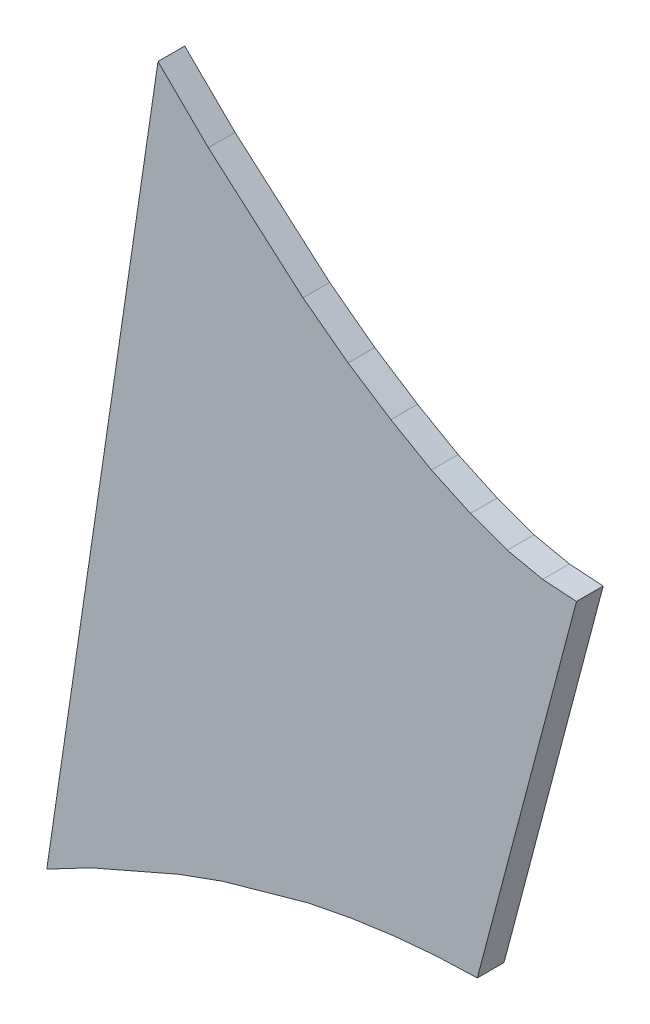
ISO-10303-21;
HEADER;
FILE_DESCRIPTION(('STEP AP214'),'2;1');
FILE_NAME('part.step','',(''),(''),'','','');
FILE_SCHEMA(('AUTOMOTIVE_DESIGN { 1 0 10303 214 1 1 1 1 }'));
ENDSEC;
DATA;
#1=APPLICATION_CONTEXT('core data for automotive mechanical design processes');
#2=APPLICATION_PROTOCOL_DEFINITION('international standard','automotive_design',2000,#1);
#3=PRODUCT_CONTEXT('',#1,'mechanical');
#4=PRODUCT('Part','Part','',(#3));
#5=PRODUCT_RELATED_PRODUCT_CATEGORY('part','',(#4));
#6=PRODUCT_DEFINITION_FORMATION('','',#4);
#7=PRODUCT_DEFINITION_CONTEXT('part definition',#1,'design');
#8=PRODUCT_DEFINITION('design','',#6,#7);
#9=PRODUCT_DEFINITION_SHAPE('','',#8);
#10=(LENGTH_UNIT() NAMED_UNIT(*) SI_UNIT(.MILLI.,.METRE.));
#11=(NAMED_UNIT(*) PLANE_ANGLE_UNIT() SI_UNIT($,.RADIAN.));
#12=(NAMED_UNIT(*) SI_UNIT($,.STERADIAN.) SOLID_ANGLE_UNIT());
#13=UNCERTAINTY_MEASURE_WITH_UNIT(LENGTH_MEASURE(1.E-05),#10,'distance_accuracy_value','');
#14=(GEOMETRIC_REPRESENTATION_CONTEXT(3) GLOBAL_UNCERTAINTY_ASSIGNED_CONTEXT((#13)) GLOBAL_UNIT_ASSIGNED_CONTEXT((#10,
#11,#12)) REPRESENTATION_CONTEXT('',''));
#15=CARTESIAN_POINT('',(0.,0.,0.));
#16=DIRECTION('',(0.,0.,1.));
#17=DIRECTION('',(1.,0.,0.));
#18=AXIS2_PLACEMENT_3D('',#15,#16,#17);
#19=CARTESIAN_POINT('',(107.907997131348,85.1029968261719,0.));
#20=DIRECTION('',(-0.0666537486392045,-0.997776166177736,0.));
#21=DIRECTION('',(-0.997776166177736,0.0666537486392045,0.));
#22=AXIS2_PLACEMENT_3D('',#19,#20,#21);
#23=PLANE('',#22);
#24=DIRECTION('',(-0.997776166177736,0.0666537486392045,0.));
#25=VECTOR('',#24,1.);
#26=CARTESIAN_POINT('',(107.907997131348,85.1029968261719,0.03556));
#27=LINE('',#26,#25);
#28=CARTESIAN_POINT('',(107.907997131348,85.1029968261719,0.03556));
#29=VERTEX_POINT('',#28);
#30=CARTESIAN_POINT('',(107.862998962402,85.1060028076172,0.03556));
#31=VERTEX_POINT('',#30);
#32=EDGE_CURVE('E11',#29,#31,#27,.T.);
#33=ORIENTED_EDGE('',*,*,#32,.F.);
#34=DIRECTION('',(0.,0.,1.));
#35=VECTOR('',#34,1.);
#36=CARTESIAN_POINT('',(107.907997131348,85.1029968261719,0.));
#37=LINE('',#36,#35);
#38=CARTESIAN_POINT('',(107.907997131348,85.1029968261719,0.));
#39=VERTEX_POINT('',#38);
#40=EDGE_CURVE('E24',#39,#29,#37,.T.);
#41=ORIENTED_EDGE('',*,*,#40,.F.);
#42=DIRECTION('',(-0.997776166177736,0.0666537486392045,0.));
#43=VECTOR('',#42,1.);
#44=CARTESIAN_POINT('',(107.907997131348,85.1029968261719,0.));
#45=LINE('',#44,#43);
#46=CARTESIAN_POINT('',(107.862998962402,85.1060028076172,0.));
#47=VERTEX_POINT('',#46);
#48=EDGE_CURVE('E166',#39,#47,#45,.T.);
#49=ORIENTED_EDGE('',*,*,#48,.T.);
#50=DIRECTION('',(0.,0.,1.));
#51=VECTOR('',#50,1.);
#52=CARTESIAN_POINT('',(107.862998962402,85.1060028076172,0.));
#53=LINE('',#52,#51);
#54=EDGE_CURVE('E37',#47,#31,#53,.T.);
#55=ORIENTED_EDGE('',*,*,#54,.T.);
#56=EDGE_LOOP('',(#33,#41,#49,#55));
#57=FACE_BOUND('',#56,.T.);
#58=ADVANCED_FACE('F17',(#57),#23,.F.);
#59=CARTESIAN_POINT('',(107.862998962402,85.1060028076172,0.));
#60=DIRECTION('',(-0.208010679666814,-0.978126554769141,0.));
#61=DIRECTION('',(-0.978126554769141,0.208010679666814,0.));
#62=AXIS2_PLACEMENT_3D('',#59,#60,#61);
#63=PLANE('',#62);
#64=DIRECTION('',(-0.978126554769141,0.208010679666814,0.));
#65=VECTOR('',#64,1.);
#66=CARTESIAN_POINT('',(107.862998962402,85.1060028076172,0.03556));
#67=LINE('',#66,#65);
#68=CARTESIAN_POINT('',(107.81600189209,85.1159973144531,0.03556));
#69=VERTEX_POINT('',#68);
#70=EDGE_CURVE('E294',#31,#69,#67,.T.);
#71=ORIENTED_EDGE('',*,*,#70,.F.);
#72=ORIENTED_EDGE('',*,*,#54,.F.);
#73=DIRECTION('',(-0.978126554769141,0.208010679666814,0.));
#74=VECTOR('',#73,1.);
#75=CARTESIAN_POINT('',(107.862998962402,85.1060028076172,0.));
#76=LINE('',#75,#74);
#77=CARTESIAN_POINT('',(107.81600189209,85.1159973144531,0.));
#78=VERTEX_POINT('',#77);
#79=EDGE_CURVE('E291',#47,#78,#76,.T.);
#80=ORIENTED_EDGE('',*,*,#79,.T.);
#81=DIRECTION('',(0.,0.,1.));
#82=VECTOR('',#81,1.);
#83=CARTESIAN_POINT('',(107.81600189209,85.1159973144531,0.));
#84=LINE('',#83,#82);
#85=EDGE_CURVE('E289',#78,#69,#84,.T.);
#86=ORIENTED_EDGE('',*,*,#85,.T.);
#87=EDGE_LOOP('',(#71,#72,#80,#86));
#88=FACE_BOUND('',#87,.T.);
#89=ADVANCED_FACE('F302',(#88),#63,.F.);
#90=CARTESIAN_POINT('',(107.81600189209,85.1159973144531,0.));
#91=DIRECTION('',(-0.344885784653725,-0.938644658826643,0.));
#92=DIRECTION('',(-0.938644658826643,0.344885784653725,0.));
#93=AXIS2_PLACEMENT_3D('',#90,#91,#92);
#94=PLANE('',#93);
#95=DIRECTION('',(-0.938644658826643,0.344885784653725,0.));
#96=VECTOR('',#95,1.);
#97=CARTESIAN_POINT('',(107.81600189209,85.1159973144531,0.03556));
#98=LINE('',#97,#96);
#99=CARTESIAN_POINT('',(107.766998291016,85.1340026855469,0.03556));
#100=VERTEX_POINT('',#99);
#101=EDGE_CURVE('E286',#69,#100,#98,.T.);
#102=ORIENTED_EDGE('',*,*,#101,.F.);
#103=ORIENTED_EDGE('',*,*,#85,.F.);
#104=DIRECTION('',(-0.938644658826643,0.344885784653725,0.));
#105=VECTOR('',#104,1.);
#106=CARTESIAN_POINT('',(107.81600189209,85.1159973144531,0.));
#107=LINE('',#106,#105);
#108=CARTESIAN_POINT('',(107.766998291016,85.1340026855469,0.));
#109=VERTEX_POINT('',#108);
#110=EDGE_CURVE('E283',#78,#109,#107,.T.);
#111=ORIENTED_EDGE('',*,*,#110,.T.);
#112=DIRECTION('',(0.,0.,1.));
#113=VECTOR('',#112,1.);
#114=CARTESIAN_POINT('',(107.766998291016,85.1340026855469,0.));
#115=LINE('',#114,#113);
#116=EDGE_CURVE('E281',#109,#100,#115,.T.);
#117=ORIENTED_EDGE('',*,*,#116,.T.);
#118=EDGE_LOOP('',(#102,#103,#111,#117));
#119=FACE_BOUND('',#118,.T.);
#120=ADVANCED_FACE('F308',(#119),#94,.F.);
#121=CARTESIAN_POINT('',(107.766998291016,85.1340026855469,0.));
#122=DIRECTION('',(-0.418965248778039,-0.908002268893837,0.));
#123=DIRECTION('',(-0.908002268893837,0.418965248778039,0.));
#124=AXIS2_PLACEMENT_3D('',#121,#122,#123);
#125=PLANE('',#124);
#126=DIRECTION('',(-0.908002268893837,0.418965248778039,0.));
#127=VECTOR('',#126,1.);
#128=CARTESIAN_POINT('',(107.766998291016,85.1340026855469,0.03556));
#129=LINE('',#128,#127);
#130=CARTESIAN_POINT('',(107.714996337891,85.1579971313476,0.03556));
#131=VERTEX_POINT('',#130);
#132=EDGE_CURVE('E278',#100,#131,#129,.T.);
#133=ORIENTED_EDGE('',*,*,#132,.F.);
#134=ORIENTED_EDGE('',*,*,#116,.F.);
#135=DIRECTION('',(-0.908002268893837,0.418965248778039,0.));
#136=VECTOR('',#135,1.);
#137=CARTESIAN_POINT('',(107.766998291016,85.1340026855469,0.));
#138=LINE('',#137,#136);
#139=CARTESIAN_POINT('',(107.714996337891,85.1579971313476,0.));
#140=VERTEX_POINT('',#139);
#141=EDGE_CURVE('E275',#109,#140,#138,.T.);
#142=ORIENTED_EDGE('',*,*,#141,.T.);
#143=DIRECTION('',(0.,0.,1.));
#144=VECTOR('',#143,1.);
#145=CARTESIAN_POINT('',(107.714996337891,85.1579971313476,0.));
#146=LINE('',#145,#144);
#147=EDGE_CURVE('E273',#140,#131,#146,.T.);
#148=ORIENTED_EDGE('',*,*,#147,.T.);
#149=EDGE_LOOP('',(#133,#134,#142,#148));
#150=FACE_BOUND('',#149,.T.);
#151=ADVANCED_FACE('F310',(#150),#125,.F.);
#152=CARTESIAN_POINT('',(107.714996337891,85.1579971313476,0.));
#153=DIRECTION('',(-0.497985277232509,-0.867185483999623,0.));
#154=DIRECTION('',(-0.867185483999623,0.497985277232509,0.));
#155=AXIS2_PLACEMENT_3D('',#152,#153,#154);
#156=PLANE('',#155);
#157=DIRECTION('',(-0.867185483999623,0.497985277232509,0.));
#158=VECTOR('',#157,1.);
#159=CARTESIAN_POINT('',(107.714996337891,85.1579971313476,0.03556));
#160=LINE('',#159,#158);
#161=CARTESIAN_POINT('',(107.661003112793,85.1890029907227,0.03556));
#162=VERTEX_POINT('',#161);
#163=EDGE_CURVE('E270',#131,#162,#160,.T.);
#164=ORIENTED_EDGE('',*,*,#163,.F.);
#165=ORIENTED_EDGE('',*,*,#147,.F.);
#166=DIRECTION('',(-0.867185483999623,0.497985277232509,0.));
#167=VECTOR('',#166,1.);
#168=CARTESIAN_POINT('',(107.714996337891,85.1579971313476,0.));
#169=LINE('',#168,#167);
#170=CARTESIAN_POINT('',(107.661003112793,85.1890029907227,0.));
#171=VERTEX_POINT('',#170);
#172=EDGE_CURVE('E267',#140,#171,#169,.T.);
#173=ORIENTED_EDGE('',*,*,#172,.T.);
#174=DIRECTION('',(0.,0.,1.));
#175=VECTOR('',#174,1.);
#176=CARTESIAN_POINT('',(107.661003112793,85.1890029907227,0.));
#177=LINE('',#176,#175);
#178=EDGE_CURVE('E265',#171,#162,#177,.T.);
#179=ORIENTED_EDGE('',*,*,#178,.T.);
#180=EDGE_LOOP('',(#164,#165,#173,#179));
#181=FACE_BOUND('',#180,.T.);
#182=ADVANCED_FACE('F315',(#181),#156,.F.);
#183=CARTESIAN_POINT('',(107.661003112793,85.1890029907227,0.));
#184=DIRECTION('',(-0.544372620992071,-0.838843519086977,0.));
#185=DIRECTION('',(-0.838843519086977,0.544372620992071,0.));
#186=AXIS2_PLACEMENT_3D('',#183,#184,#185);
#187=PLANE('',#186);
#188=DIRECTION('',(-0.838843519086977,0.544372620992071,0.));
#189=VECTOR('',#188,1.);
#190=CARTESIAN_POINT('',(107.661003112793,85.1890029907227,0.03556));
#191=LINE('',#190,#189);
#192=CARTESIAN_POINT('',(107.603996276855,85.2259979248047,0.03556));
#193=VERTEX_POINT('',#192);
#194=EDGE_CURVE('E262',#162,#193,#191,.T.);
#195=ORIENTED_EDGE('',*,*,#194,.F.);
#196=ORIENTED_EDGE('',*,*,#178,.F.);
#197=DIRECTION('',(-0.838843519086977,0.544372620992071,0.));
#198=VECTOR('',#197,1.);
#199=CARTESIAN_POINT('',(107.661003112793,85.1890029907227,0.));
#200=LINE('',#199,#198);
#201=CARTESIAN_POINT('',(107.603996276855,85.2259979248047,0.));
#202=VERTEX_POINT('',#201);
#203=EDGE_CURVE('E259',#171,#202,#200,.T.);
#204=ORIENTED_EDGE('',*,*,#203,.T.);
#205=DIRECTION('',(0.,0.,1.));
#206=VECTOR('',#205,1.);
#207=CARTESIAN_POINT('',(107.603996276855,85.2259979248047,0.));
#208=LINE('',#207,#206);
#209=EDGE_CURVE('E257',#202,#193,#208,.T.);
#210=ORIENTED_EDGE('',*,*,#209,.T.);
#211=EDGE_LOOP('',(#195,#196,#204,#210));
#212=FACE_BOUND('',#211,.T.);
#213=ADVANCED_FACE('F318',(#212),#187,.F.);
#214=CARTESIAN_POINT('',(107.603996276855,85.2259979248047,0.));
#215=DIRECTION('',(-0.60006510085519,-0.799951170219565,0.));
#216=DIRECTION('',(-0.799951170219565,0.60006510085519,0.));
#217=AXIS2_PLACEMENT_3D('',#214,#215,#216);
#218=PLANE('',#217);
#219=DIRECTION('',(-0.799951170219565,0.60006510085519,0.));
#220=VECTOR('',#219,1.);
#221=CARTESIAN_POINT('',(107.603996276855,85.2259979248047,0.03556));
#222=LINE('',#221,#220);
#223=CARTESIAN_POINT('',(107.543998718262,85.2710037231445,0.03556));
#224=VERTEX_POINT('',#223);
#225=EDGE_CURVE('E254',#193,#224,#222,.T.);
#226=ORIENTED_EDGE('',*,*,#225,.F.);
#227=ORIENTED_EDGE('',*,*,#209,.F.);
#228=DIRECTION('',(-0.799951170219565,0.60006510085519,0.));
#229=VECTOR('',#228,1.);
#230=CARTESIAN_POINT('',(107.603996276855,85.2259979248047,0.));
#231=LINE('',#230,#229);
#232=CARTESIAN_POINT('',(107.543998718262,85.2710037231445,0.));
#233=VERTEX_POINT('',#232);
#234=EDGE_CURVE('E251',#202,#233,#231,.T.);
#235=ORIENTED_EDGE('',*,*,#234,.T.);
#236=DIRECTION('',(0.,0.,1.));
#237=VECTOR('',#236,1.);
#238=CARTESIAN_POINT('',(107.543998718262,85.2710037231445,0.));
#239=LINE('',#238,#237);
#240=EDGE_CURVE('E249',#233,#224,#239,.T.);
#241=ORIENTED_EDGE('',*,*,#240,.T.);
#242=EDGE_LOOP('',(#226,#227,#235,#241));
#243=FACE_BOUND('',#242,.T.);
#244=ADVANCED_FACE('F323',(#243),#218,.F.);
#245=CARTESIAN_POINT('',(107.543998718262,85.2710037231445,0.));
#246=DIRECTION('',(-0.657635460506401,-0.753336313398295,0.));
#247=DIRECTION('',(-0.753336313398295,0.657635460506401,0.));
#248=AXIS2_PLACEMENT_3D('',#245,#246,#247);
#249=PLANE('',#248);
#250=DIRECTION('',(-0.753336313398295,0.657635460506401,0.));
#251=VECTOR('',#250,1.);
#252=CARTESIAN_POINT('',(107.543998718262,85.2710037231445,0.03556));
#253=LINE('',#252,#251);
#254=CARTESIAN_POINT('',(107.417999267578,85.3809967041016,0.03556));
#255=VERTEX_POINT('',#254);
#256=EDGE_CURVE('E246',#224,#255,#253,.T.);
#257=ORIENTED_EDGE('',*,*,#256,.F.);
#258=ORIENTED_EDGE('',*,*,#240,.F.);
#259=DIRECTION('',(-0.753336313398295,0.657635460506401,0.));
#260=VECTOR('',#259,1.);
#261=CARTESIAN_POINT('',(107.543998718262,85.2710037231445,0.));
#262=LINE('',#261,#260);
#263=CARTESIAN_POINT('',(107.417999267578,85.3809967041016,0.));
#264=VERTEX_POINT('',#263);
#265=EDGE_CURVE('E243',#233,#264,#262,.T.);
#266=ORIENTED_EDGE('',*,*,#265,.T.);
#267=DIRECTION('',(0.,0.,1.));
#268=VECTOR('',#267,1.);
#269=CARTESIAN_POINT('',(107.417999267578,85.3809967041016,0.));
#270=LINE('',#269,#268);
#271=EDGE_CURVE('E241',#264,#255,#270,.T.);
#272=ORIENTED_EDGE('',*,*,#271,.T.);
#273=EDGE_LOOP('',(#257,#258,#266,#272));
#274=FACE_BOUND('',#273,.T.);
#275=ADVANCED_FACE('F326',(#274),#249,.F.);
#276=CARTESIAN_POINT('',(107.417999267578,85.3809967041016,0.));
#277=DIRECTION('',(-0.701773425170398,-0.712400210362552,0.));
#278=DIRECTION('',(-0.712400210362552,0.701773425170398,0.));
#279=AXIS2_PLACEMENT_3D('',#276,#277,#278);
#280=PLANE('',#279);
#281=DIRECTION('',(-0.712400210362552,0.701773425170398,0.));
#282=VECTOR('',#281,1.);
#283=CARTESIAN_POINT('',(107.417999267578,85.3809967041016,0.03556));
#284=LINE('',#283,#282);
#285=CARTESIAN_POINT('',(107.350997924805,85.4469985961914,0.03556));
#286=VERTEX_POINT('',#285);
#287=EDGE_CURVE('E238',#255,#286,#284,.T.);
#288=ORIENTED_EDGE('',*,*,#287,.F.);
#289=ORIENTED_EDGE('',*,*,#271,.F.);
#290=DIRECTION('',(-0.712400210362552,0.701773425170398,0.));
#291=VECTOR('',#290,1.);
#292=CARTESIAN_POINT('',(107.417999267578,85.3809967041016,0.));
#293=LINE('',#292,#291);
#294=CARTESIAN_POINT('',(107.350997924805,85.4469985961914,0.));
#295=VERTEX_POINT('',#294);
#296=EDGE_CURVE('E235',#264,#295,#293,.T.);
#297=ORIENTED_EDGE('',*,*,#296,.T.);
#298=DIRECTION('',(0.,0.,1.));
#299=VECTOR('',#298,1.);
#300=CARTESIAN_POINT('',(107.350997924805,85.4469985961914,0.));
#301=LINE('',#300,#299);
#302=EDGE_CURVE('E233',#295,#286,#301,.T.);
#303=ORIENTED_EDGE('',*,*,#302,.T.);
#304=EDGE_LOOP('',(#288,#289,#297,#303));
#305=FACE_BOUND('',#304,.T.);
#306=ADVANCED_FACE('F331',(#305),#280,.F.);
#307=CARTESIAN_POINT('',(107.350997924805,85.4469985961914,0.));
#308=DIRECTION('',(0.98933059440612,-0.14568793694755,0.));
#309=DIRECTION('',(-0.14568793694755,-0.98933059440612,0.));
#310=AXIS2_PLACEMENT_3D('',#307,#308,#309);
#311=PLANE('',#310);
#312=DIRECTION('',(-0.14568793694755,-0.98933059440612,0.));
#313=VECTOR('',#312,1.);
#314=CARTESIAN_POINT('',(107.350997924805,85.4469985961914,0.03556));
#315=LINE('',#314,#313);
#316=CARTESIAN_POINT('',(107.203002929688,84.4420013427734,0.03556));
#317=VERTEX_POINT('',#316);
#318=EDGE_CURVE('E230',#286,#317,#315,.T.);
#319=ORIENTED_EDGE('',*,*,#318,.F.);
#320=ORIENTED_EDGE('',*,*,#302,.F.);
#321=DIRECTION('',(-0.14568793694755,-0.98933059440612,0.));
#322=VECTOR('',#321,1.);
#323=CARTESIAN_POINT('',(107.350997924805,85.4469985961914,0.));
#324=LINE('',#323,#322);
#325=CARTESIAN_POINT('',(107.203002929688,84.4420013427734,0.));
#326=VERTEX_POINT('',#325);
#327=EDGE_CURVE('E227',#295,#326,#324,.T.);
#328=ORIENTED_EDGE('',*,*,#327,.T.);
#329=DIRECTION('',(0.,0.,1.));
#330=VECTOR('',#329,1.);
#331=CARTESIAN_POINT('',(107.203002929688,84.4420013427734,0.));
#332=LINE('',#331,#330);
#333=EDGE_CURVE('E225',#326,#317,#332,.T.);
#334=ORIENTED_EDGE('',*,*,#333,.T.);
#335=EDGE_LOOP('',(#319,#320,#328,#334));
#336=FACE_BOUND('',#335,.T.);
#337=ADVANCED_FACE('F334',(#336),#311,.F.);
#338=CARTESIAN_POINT('',(107.203002929688,84.4420013427734,0.));
#339=DIRECTION('',(-0.465118804661611,0.885248268877242,0.));
#340=DIRECTION('',(0.885248268877242,0.465118804661611,0.));
#341=AXIS2_PLACEMENT_3D('',#338,#339,#340);
#342=PLANE('',#341);
#343=DIRECTION('',(0.885248268877242,0.465118804661611,0.));
#344=VECTOR('',#343,1.);
#345=CARTESIAN_POINT('',(107.203002929688,84.4420013427734,0.03556));
#346=LINE('',#345,#344);
#347=CARTESIAN_POINT('',(107.262001037598,84.4729995727539,0.03556));
#348=VERTEX_POINT('',#347);
#349=EDGE_CURVE('E222',#317,#348,#346,.T.);
#350=ORIENTED_EDGE('',*,*,#349,.F.);
#351=ORIENTED_EDGE('',*,*,#333,.F.);
#352=DIRECTION('',(0.885248268877242,0.465118804661611,0.));
#353=VECTOR('',#352,1.);
#354=CARTESIAN_POINT('',(107.203002929688,84.4420013427734,0.));
#355=LINE('',#354,#353);
#356=CARTESIAN_POINT('',(107.262001037598,84.4729995727539,0.));
#357=VERTEX_POINT('',#356);
#358=EDGE_CURVE('E219',#326,#357,#355,.T.);
#359=ORIENTED_EDGE('',*,*,#358,.T.);
#360=DIRECTION('',(0.,0.,1.));
#361=VECTOR('',#360,1.);
#362=CARTESIAN_POINT('',(107.262001037598,84.4729995727539,0.));
#363=LINE('',#362,#361);
#364=EDGE_CURVE('E217',#357,#348,#363,.T.);
#365=ORIENTED_EDGE('',*,*,#364,.T.);
#366=EDGE_LOOP('',(#350,#351,#359,#365));
#367=FACE_BOUND('',#366,.T.);
#368=ADVANCED_FACE('F339',(#367),#342,.F.);
#369=CARTESIAN_POINT('',(107.262001037598,84.4729995727539,0.));
#370=DIRECTION('',(-0.399611180735083,0.91668473546335,0.));
#371=DIRECTION('',(0.91668473546335,0.399611180735083,0.));
#372=AXIS2_PLACEMENT_3D('',#369,#370,#371);
#373=PLANE('',#372);
#374=DIRECTION('',(0.91668473546335,0.399611180735083,0.));
#375=VECTOR('',#374,1.);
#376=CARTESIAN_POINT('',(107.262001037598,84.4729995727539,0.03556));
#377=LINE('',#376,#375);
#378=CARTESIAN_POINT('',(107.378997802734,84.5240020751953,0.03556));
#379=VERTEX_POINT('',#378);
#380=EDGE_CURVE('E214',#348,#379,#377,.T.);
#381=ORIENTED_EDGE('',*,*,#380,.F.);
#382=ORIENTED_EDGE('',*,*,#364,.F.);
#383=DIRECTION('',(0.91668473546335,0.399611180735083,0.));
#384=VECTOR('',#383,1.);
#385=CARTESIAN_POINT('',(107.262001037598,84.4729995727539,0.));
#386=LINE('',#385,#384);
#387=CARTESIAN_POINT('',(107.378997802734,84.5240020751953,0.));
#388=VERTEX_POINT('',#387);
#389=EDGE_CURVE('E211',#357,#388,#386,.T.);
#390=ORIENTED_EDGE('',*,*,#389,.T.);
#391=DIRECTION('',(0.,0.,1.));
#392=VECTOR('',#391,1.);
#393=CARTESIAN_POINT('',(107.378997802734,84.5240020751953,0.));
#394=LINE('',#393,#392);
#395=EDGE_CURVE('E209',#388,#379,#394,.T.);
#396=ORIENTED_EDGE('',*,*,#395,.T.);
#397=EDGE_LOOP('',(#381,#382,#390,#396));
#398=FACE_BOUND('',#397,.T.);
#399=ADVANCED_FACE('F342',(#398),#373,.F.);
#400=CARTESIAN_POINT('',(107.378997802734,84.5240020751953,0.));
#401=DIRECTION('',(-0.340392062649101,0.940283597477639,0.));
#402=DIRECTION('',(0.940283597477639,0.340392062649101,0.));
#403=AXIS2_PLACEMENT_3D('',#400,#401,#402);
#404=PLANE('',#403);
#405=DIRECTION('',(0.940283597477639,0.340392062649101,0.));
#406=VECTOR('',#405,1.);
#407=CARTESIAN_POINT('',(107.378997802734,84.5240020751953,0.03556));
#408=LINE('',#407,#406);
#409=CARTESIAN_POINT('',(107.436996459961,84.5449981689453,0.03556));
#410=VERTEX_POINT('',#409);
#411=EDGE_CURVE('E206',#379,#410,#408,.T.);
#412=ORIENTED_EDGE('',*,*,#411,.F.);
#413=ORIENTED_EDGE('',*,*,#395,.F.);
#414=DIRECTION('',(0.940283597477639,0.340392062649101,0.));
#415=VECTOR('',#414,1.);
#416=CARTESIAN_POINT('',(107.378997802734,84.5240020751953,0.));
#417=LINE('',#416,#415);
#418=CARTESIAN_POINT('',(107.436996459961,84.5449981689453,0.));
#419=VERTEX_POINT('',#418);
#420=EDGE_CURVE('E203',#388,#419,#417,.T.);
#421=ORIENTED_EDGE('',*,*,#420,.T.);
#422=DIRECTION('',(0.,0.,1.));
#423=VECTOR('',#422,1.);
#424=CARTESIAN_POINT('',(107.436996459961,84.5449981689453,0.));
#425=LINE('',#424,#423);
#426=EDGE_CURVE('E201',#419,#410,#425,.T.);
#427=ORIENTED_EDGE('',*,*,#426,.T.);
#428=EDGE_LOOP('',(#412,#413,#421,#427));
#429=FACE_BOUND('',#428,.T.);
#430=ADVANCED_FACE('F347',(#429),#404,.F.);
#431=CARTESIAN_POINT('',(107.436996459961,84.5449981689453,0.));
#432=DIRECTION('',(-0.270284680475076,0.962780448233389,0.));
#433=DIRECTION('',(0.962780448233389,0.270284680475076,0.));
#434=AXIS2_PLACEMENT_3D('',#431,#432,#433);
#435=PLANE('',#434);
#436=DIRECTION('',(0.962780448233389,0.270284680475076,0.));
#437=VECTOR('',#436,1.);
#438=CARTESIAN_POINT('',(107.436996459961,84.5449981689453,0.03556));
#439=LINE('',#438,#437);
#440=CARTESIAN_POINT('',(107.551002502441,84.5770034790039,0.03556));
#441=VERTEX_POINT('',#440);
#442=EDGE_CURVE('E198',#410,#441,#439,.T.);
#443=ORIENTED_EDGE('',*,*,#442,.F.);
#444=ORIENTED_EDGE('',*,*,#426,.F.);
#445=DIRECTION('',(0.962780448233389,0.270284680475076,0.));
#446=VECTOR('',#445,1.);
#447=CARTESIAN_POINT('',(107.436996459961,84.5449981689453,0.));
#448=LINE('',#447,#446);
#449=CARTESIAN_POINT('',(107.551002502441,84.5770034790039,0.));
#450=VERTEX_POINT('',#449);
#451=EDGE_CURVE('E195',#419,#450,#448,.T.);
#452=ORIENTED_EDGE('',*,*,#451,.T.);
#453=DIRECTION('',(0.,0.,1.));
#454=VECTOR('',#453,1.);
#455=CARTESIAN_POINT('',(107.551002502441,84.5770034790039,0.));
#456=LINE('',#455,#454);
#457=EDGE_CURVE('E193',#450,#441,#456,.T.);
#458=ORIENTED_EDGE('',*,*,#457,.T.);
#459=EDGE_LOOP('',(#443,#444,#452,#458));
#460=FACE_BOUND('',#459,.T.);
#461=ADVANCED_FACE('F350',(#460),#435,.F.);
#462=CARTESIAN_POINT('',(107.551002502441,84.5770034790039,0.));
#463=DIRECTION('',(-0.189388452885351,0.981902242544385,0.));
#464=DIRECTION('',(0.981902242544385,0.189388452885351,0.));
#465=AXIS2_PLACEMENT_3D('',#462,#463,#464);
#466=PLANE('',#465);
#467=DIRECTION('',(0.981902242544385,0.189388452885351,0.));
#468=VECTOR('',#467,1.);
#469=CARTESIAN_POINT('',(107.551002502441,84.5770034790039,0.03556));
#470=LINE('',#469,#468);
#471=CARTESIAN_POINT('',(107.608001708984,84.5879974365234,0.03556));
#472=VERTEX_POINT('',#471);
#473=EDGE_CURVE('E190',#441,#472,#470,.T.);
#474=ORIENTED_EDGE('',*,*,#473,.F.);
#475=ORIENTED_EDGE('',*,*,#457,.F.);
#476=DIRECTION('',(0.981902242544385,0.189388452885351,0.));
#477=VECTOR('',#476,1.);
#478=CARTESIAN_POINT('',(107.551002502441,84.5770034790039,0.));
#479=LINE('',#478,#477);
#480=CARTESIAN_POINT('',(107.608001708984,84.5879974365234,0.));
#481=VERTEX_POINT('',#480);
#482=EDGE_CURVE('E187',#450,#481,#479,.T.);
#483=ORIENTED_EDGE('',*,*,#482,.T.);
#484=DIRECTION('',(0.,0.,1.));
#485=VECTOR('',#484,1.);
#486=CARTESIAN_POINT('',(107.608001708984,84.5879974365234,0.));
#487=LINE('',#486,#485);
#488=EDGE_CURVE('E185',#481,#472,#487,.T.);
#489=ORIENTED_EDGE('',*,*,#488,.T.);
#490=EDGE_LOOP('',(#474,#475,#483,#489));
#491=FACE_BOUND('',#490,.T.);
#492=ADVANCED_FACE('F355',(#491),#466,.F.);
#493=CARTESIAN_POINT('',(107.608001708984,84.5879974365234,0.));
#494=DIRECTION('',(-0.139045641329027,0.990285973659831,0.));
#495=DIRECTION('',(0.990285973659831,0.139045641329027,0.));
#496=AXIS2_PLACEMENT_3D('',#493,#494,#495);
#497=PLANE('',#496);
#498=DIRECTION('',(0.990285973659831,0.139045641329027,0.));
#499=VECTOR('',#498,1.);
#500=CARTESIAN_POINT('',(107.608001708984,84.5879974365234,0.03556));
#501=LINE('',#500,#499);
#502=CARTESIAN_POINT('',(107.665000915527,84.5960006713867,0.03556));
#503=VERTEX_POINT('',#502);
#504=EDGE_CURVE('E182',#472,#503,#501,.T.);
#505=ORIENTED_EDGE('',*,*,#504,.F.);
#506=ORIENTED_EDGE('',*,*,#488,.F.);
#507=DIRECTION('',(0.990285973659831,0.139045641329027,0.));
#508=VECTOR('',#507,1.);
#509=CARTESIAN_POINT('',(107.608001708984,84.5879974365234,0.));
#510=LINE('',#509,#508);
#511=CARTESIAN_POINT('',(107.665000915527,84.5960006713867,0.));
#512=VERTEX_POINT('',#511);
#513=EDGE_CURVE('E179',#481,#512,#510,.T.);
#514=ORIENTED_EDGE('',*,*,#513,.T.);
#515=DIRECTION('',(0.,0.,1.));
#516=VECTOR('',#515,1.);
#517=CARTESIAN_POINT('',(107.665000915527,84.5960006713867,0.));
#518=LINE('',#517,#516);
#519=EDGE_CURVE('E177',#512,#503,#518,.T.);
#520=ORIENTED_EDGE('',*,*,#519,.T.);
#521=EDGE_LOOP('',(#505,#506,#514,#520));
#522=FACE_BOUND('',#521,.T.);
#523=ADVANCED_FACE('F358',(#522),#497,.F.);
#524=CARTESIAN_POINT('',(107.665000915527,84.5960006713867,0.));
#525=DIRECTION('',(-0.0888838566909104,0.996041997116462,0.));
#526=DIRECTION('',(0.996041997116462,0.0888838566909104,0.));
#527=AXIS2_PLACEMENT_3D('',#524,#525,#526);
#528=PLANE('',#527);
#529=DIRECTION('',(0.996041997116462,0.0888838566909104,0.));
#530=VECTOR('',#529,1.);
#531=CARTESIAN_POINT('',(107.665000915527,84.5960006713867,0.03556));
#532=LINE('',#531,#530);
#533=CARTESIAN_POINT('',(107.721000671387,84.6009979248047,0.03556));
#534=VERTEX_POINT('',#533);
#535=EDGE_CURVE('E174',#503,#534,#532,.T.);
#536=ORIENTED_EDGE('',*,*,#535,.F.);
#537=ORIENTED_EDGE('',*,*,#519,.F.);
#538=DIRECTION('',(0.996041997116462,0.0888838566909104,0.));
#539=VECTOR('',#538,1.);
#540=CARTESIAN_POINT('',(107.665000915527,84.5960006713867,0.));
#541=LINE('',#540,#539);
#542=CARTESIAN_POINT('',(107.721000671387,84.6009979248047,0.));
#543=VERTEX_POINT('',#542);
#544=EDGE_CURVE('E172',#512,#543,#541,.T.);
#545=ORIENTED_EDGE('',*,*,#544,.T.);
#546=DIRECTION('',(0.,0.,1.));
#547=VECTOR('',#546,1.);
#548=CARTESIAN_POINT('',(107.721000671387,84.6009979248047,0.));
#549=LINE('',#548,#547);
#550=EDGE_CURVE('E157',#543,#534,#549,.T.);
#551=ORIENTED_EDGE('',*,*,#550,.T.);
#552=EDGE_LOOP('',(#536,#537,#545,#551));
#553=FACE_BOUND('',#552,.T.);
#554=ADVANCED_FACE('F361',(#553),#528,.F.);
#555=CARTESIAN_POINT('',(107.721000671387,84.6009979248047,0.));
#556=DIRECTION('',(-0.0363194812398622,0.999340229993003,0.));
#557=DIRECTION('',(0.999340229993003,0.0363194812398622,0.));
#558=AXIS2_PLACEMENT_3D('',#555,#556,#557);
#559=PLANE('',#558);
#560=DIRECTION('',(0.999340229993003,0.0363194812398622,0.));
#561=VECTOR('',#560,1.);
#562=CARTESIAN_POINT('',(107.721000671387,84.6009979248047,0.03556));
#563=LINE('',#562,#561);
#564=CARTESIAN_POINT('',(107.776000976563,84.6029968261719,0.03556));
#565=VERTEX_POINT('',#564);
#566=EDGE_CURVE('E161',#534,#565,#563,.T.);
#567=ORIENTED_EDGE('',*,*,#566,.F.);
#568=ORIENTED_EDGE('',*,*,#550,.F.);
#569=DIRECTION('',(0.999340229993003,0.0363194812398622,0.));
#570=VECTOR('',#569,1.);
#571=CARTESIAN_POINT('',(107.721000671387,84.6009979248047,0.));
#572=LINE('',#571,#570);
#573=CARTESIAN_POINT('',(107.776000976563,84.6029968261719,0.));
#574=VERTEX_POINT('',#573);
#575=EDGE_CURVE('E153',#543,#574,#572,.T.);
#576=ORIENTED_EDGE('',*,*,#575,.T.);
#577=DIRECTION('',(0.,0.,1.));
#578=VECTOR('',#577,1.);
#579=CARTESIAN_POINT('',(107.776000976563,84.6029968261719,0.));
#580=LINE('',#579,#578);
#581=EDGE_CURVE('E143',#574,#565,#580,.T.);
#582=ORIENTED_EDGE('',*,*,#581,.T.);
#583=EDGE_LOOP('',(#567,#568,#576,#582));
#584=FACE_BOUND('',#583,.T.);
#585=ADVANCED_FACE('F156',(#584),#559,.F.);
#586=CARTESIAN_POINT('',(107.776000976563,84.6029968261719,0.));
#587=DIRECTION('',(-0.966875684202981,0.255247744940121,0.));
#588=DIRECTION('',(0.255247744940121,0.966875684202981,0.));
#589=AXIS2_PLACEMENT_3D('',#586,#587,#588);
#590=PLANE('',#589);
#591=DIRECTION('',(0.255247744940121,0.966875684202981,0.));
#592=VECTOR('',#591,1.);
#593=CARTESIAN_POINT('',(107.776000976563,84.6029968261719,0.03556));
#594=LINE('',#593,#592);
#595=EDGE_CURVE('E149',#565,#29,#594,.T.);
#596=ORIENTED_EDGE('',*,*,#595,.F.);
#597=ORIENTED_EDGE('',*,*,#581,.F.);
#598=DIRECTION('',(0.255247744940121,0.966875684202981,0.));
#599=VECTOR('',#598,1.);
#600=CARTESIAN_POINT('',(107.776000976563,84.6029968261719,0.));
#601=LINE('',#600,#599);
#602=EDGE_CURVE('E147',#574,#39,#601,.T.);
#603=ORIENTED_EDGE('',*,*,#602,.T.);
#604=ORIENTED_EDGE('',*,*,#40,.T.);
#605=EDGE_LOOP('',(#596,#597,#603,#604));
#606=FACE_BOUND('',#605,.T.);
#607=ADVANCED_FACE('F145',(#606),#590,.F.);
#608=CARTESIAN_POINT('',(107.907997131348,85.1029968261719,0.));
#609=DIRECTION('',(0.,0.,1.));
#610=DIRECTION('',(1.,0.,0.));
#611=AXIS2_PLACEMENT_3D('',#608,#609,#610);
#612=PLANE('',#611);
#613=ORIENTED_EDGE('',*,*,#602,.F.);
#614=ORIENTED_EDGE('',*,*,#575,.F.);
#615=ORIENTED_EDGE('',*,*,#544,.F.);
#616=ORIENTED_EDGE('',*,*,#513,.F.);
#617=ORIENTED_EDGE('',*,*,#482,.F.);
#618=ORIENTED_EDGE('',*,*,#451,.F.);
#619=ORIENTED_EDGE('',*,*,#420,.F.);
#620=ORIENTED_EDGE('',*,*,#389,.F.);
#621=ORIENTED_EDGE('',*,*,#358,.F.);
#622=ORIENTED_EDGE('',*,*,#327,.F.);
#623=ORIENTED_EDGE('',*,*,#296,.F.);
#624=ORIENTED_EDGE('',*,*,#265,.F.);
#625=ORIENTED_EDGE('',*,*,#234,.F.);
#626=ORIENTED_EDGE('',*,*,#203,.F.);
#627=ORIENTED_EDGE('',*,*,#172,.F.);
#628=ORIENTED_EDGE('',*,*,#141,.F.);
#629=ORIENTED_EDGE('',*,*,#110,.F.);
#630=ORIENTED_EDGE('',*,*,#79,.F.);
#631=ORIENTED_EDGE('',*,*,#48,.F.);
#632=EDGE_LOOP('',(#613,#614,#615,#616,#617,#618,#619,#620,#621,#622,#623,#624,#625,#626,#627,
#628,#629,#630,#631));
#633=FACE_BOUND('',#632,.T.);
#634=ADVANCED_FACE('F164',(#633),#612,.F.);
#635=CARTESIAN_POINT('',(107.907997131348,85.1029968261719,0.03556));
#636=DIRECTION('',(0.,0.,1.));
#637=DIRECTION('',(1.,0.,0.));
#638=AXIS2_PLACEMENT_3D('',#635,#636,#637);
#639=PLANE('',#638);
#640=ORIENTED_EDGE('',*,*,#32,.T.);
#641=ORIENTED_EDGE('',*,*,#70,.T.);
#642=ORIENTED_EDGE('',*,*,#101,.T.);
#643=ORIENTED_EDGE('',*,*,#132,.T.);
#644=ORIENTED_EDGE('',*,*,#163,.T.);
#645=ORIENTED_EDGE('',*,*,#194,.T.);
#646=ORIENTED_EDGE('',*,*,#225,.T.);
#647=ORIENTED_EDGE('',*,*,#256,.T.);
#648=ORIENTED_EDGE('',*,*,#287,.T.);
#649=ORIENTED_EDGE('',*,*,#318,.T.);
#650=ORIENTED_EDGE('',*,*,#349,.T.);
#651=ORIENTED_EDGE('',*,*,#380,.T.);
#652=ORIENTED_EDGE('',*,*,#411,.T.);
#653=ORIENTED_EDGE('',*,*,#442,.T.);
#654=ORIENTED_EDGE('',*,*,#473,.T.);
#655=ORIENTED_EDGE('',*,*,#504,.T.);
#656=ORIENTED_EDGE('',*,*,#535,.T.);
#657=ORIENTED_EDGE('',*,*,#566,.T.);
#658=ORIENTED_EDGE('',*,*,#595,.T.);
#659=EDGE_LOOP('',(#640,#641,#642,#643,#644,#645,#646,#647,#648,#649,#650,#651,#652,#653,#654,
#655,#656,#657,#658));
#660=FACE_BOUND('',#659,.T.);
#661=ADVANCED_FACE('F305',(#660),#639,.T.);
#662=CLOSED_SHELL('',(#58,#89,#120,#151,#182,#213,#244,#275,#306,#337,#368,#399,#430,#461,#492,
#523,#554,#585,#607,#634,#661));
#663=MANIFOLD_SOLID_BREP('B1',#662);
#664=ADVANCED_BREP_SHAPE_REPRESENTATION('',(#18,#663),#14);
#665=SHAPE_DEFINITION_REPRESENTATION(#9,#664);
ENDSEC;
END-ISO-10303-21;
